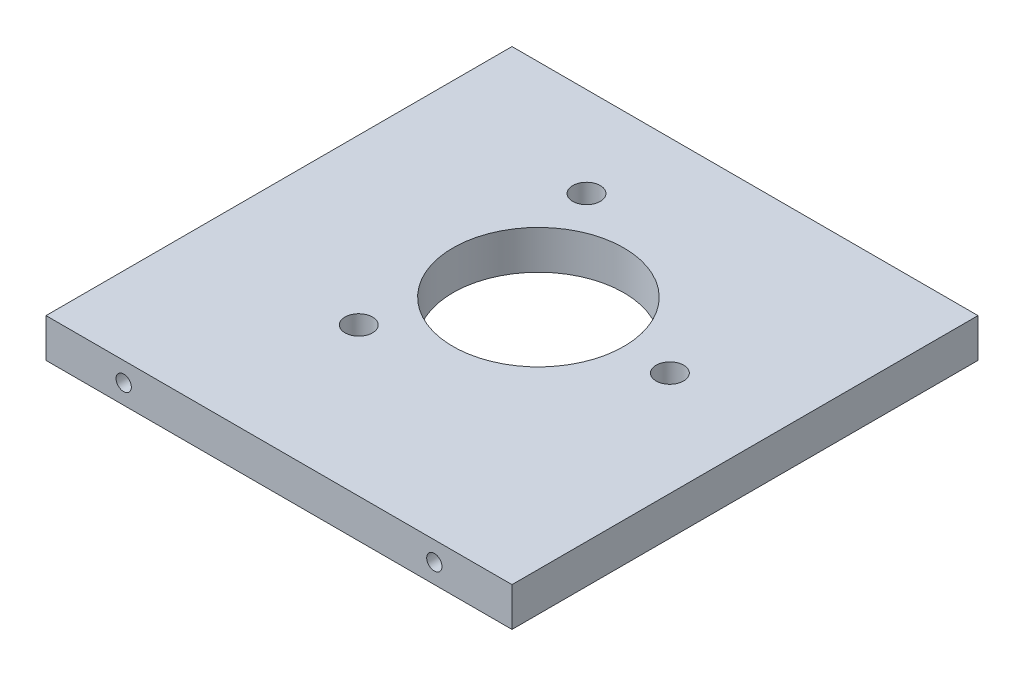
ISO-10303-21;
HEADER;
FILE_DESCRIPTION(('STEP AP214'),'2;1');
FILE_NAME('part.step','',(''),(''),'','','');
FILE_SCHEMA(('AUTOMOTIVE_DESIGN { 1 0 10303 214 1 1 1 1 }'));
ENDSEC;
DATA;
#1=APPLICATION_CONTEXT('core data for automotive mechanical design processes');
#2=APPLICATION_PROTOCOL_DEFINITION('international standard','automotive_design',2000,#1);
#3=PRODUCT_CONTEXT('',#1,'mechanical');
#4=PRODUCT('Part','Part','',(#3));
#5=PRODUCT_RELATED_PRODUCT_CATEGORY('part','',(#4));
#6=PRODUCT_DEFINITION_FORMATION('','',#4);
#7=PRODUCT_DEFINITION_CONTEXT('part definition',#1,'design');
#8=PRODUCT_DEFINITION('design','',#6,#7);
#9=PRODUCT_DEFINITION_SHAPE('','',#8);
#10=(LENGTH_UNIT() NAMED_UNIT(*) SI_UNIT(.MILLI.,.METRE.));
#11=(NAMED_UNIT(*) PLANE_ANGLE_UNIT() SI_UNIT($,.RADIAN.));
#12=(NAMED_UNIT(*) SI_UNIT($,.STERADIAN.) SOLID_ANGLE_UNIT());
#13=UNCERTAINTY_MEASURE_WITH_UNIT(LENGTH_MEASURE(1.E-05),#10,'distance_accuracy_value','');
#14=(GEOMETRIC_REPRESENTATION_CONTEXT(3) GLOBAL_UNCERTAINTY_ASSIGNED_CONTEXT((#13)) GLOBAL_UNIT_ASSIGNED_CONTEXT((#10,
#11,#12)) REPRESENTATION_CONTEXT('',''));
#15=CARTESIAN_POINT('',(0.,0.,0.));
#16=DIRECTION('',(0.,0.,1.));
#17=DIRECTION('',(1.,0.,0.));
#18=AXIS2_PLACEMENT_3D('',#15,#16,#17);
#19=CARTESIAN_POINT('',(-38.1,3.175,76.2));
#20=DIRECTION('',(1.,0.,0.));
#21=DIRECTION('',(0.,0.,-1.));
#22=AXIS2_PLACEMENT_3D('',#19,#20,#21);
#23=PLANE('',#22);
#24=DIRECTION('',(0.,0.,-1.));
#25=VECTOR('',#24,1.);
#26=CARTESIAN_POINT('',(-38.1,3.175,76.2));
#27=LINE('',#26,#25);
#28=CARTESIAN_POINT('',(-38.1,3.175,76.2));
#29=VERTEX_POINT('',#28);
#30=CARTESIAN_POINT('',(-38.1,3.175,0.));
#31=VERTEX_POINT('',#30);
#32=EDGE_CURVE('E153',#29,#31,#27,.T.);
#33=ORIENTED_EDGE('',*,*,#32,.T.);
#34=DIRECTION('',(0.,-1.,0.));
#35=VECTOR('',#34,1.);
#36=CARTESIAN_POINT('',(-38.1,3.175,0.));
#37=LINE('',#36,#35);
#38=CARTESIAN_POINT('',(-38.1,-3.175,0.));
#39=VERTEX_POINT('',#38);
#40=EDGE_CURVE('E54',#31,#39,#37,.T.);
#41=ORIENTED_EDGE('',*,*,#40,.T.);
#42=DIRECTION('',(0.,0.,-1.));
#43=VECTOR('',#42,1.);
#44=CARTESIAN_POINT('',(-38.1,-3.175,76.2));
#45=LINE('',#44,#43);
#46=CARTESIAN_POINT('',(-38.1,-3.175,76.2));
#47=VERTEX_POINT('',#46);
#48=EDGE_CURVE('E11',#47,#39,#45,.T.);
#49=ORIENTED_EDGE('',*,*,#48,.F.);
#50=DIRECTION('',(0.,-1.,0.));
#51=VECTOR('',#50,1.);
#52=CARTESIAN_POINT('',(-38.1,3.175,76.2));
#53=LINE('',#52,#51);
#54=EDGE_CURVE('E144',#29,#47,#53,.T.);
#55=ORIENTED_EDGE('',*,*,#54,.F.);
#56=EDGE_LOOP('',(#33,#41,#49,#55));
#57=FACE_BOUND('',#56,.T.);
#58=ADVANCED_FACE('F40',(#57),#23,.F.);
#59=CARTESIAN_POINT('',(38.1,-3.175,76.2));
#60=DIRECTION('',(0.,1.,0.));
#61=DIRECTION('',(0.,0.,1.));
#62=AXIS2_PLACEMENT_3D('',#59,#60,#61);
#63=PLANE('',#62);
#64=CARTESIAN_POINT('',(-11.2009516410944,-3.175,14.71452024663));
#65=DIRECTION('',(0.,-1.,0.));
#66=DIRECTION('',(0.,0.,-1.));
#67=AXIS2_PLACEMENT_3D('',#64,#65,#66);
#68=CIRCLE('',#67,4.7);
#69=CARTESIAN_POINT('',(-11.2009516410944,-3.175,10.01452024663));
#70=VERTEX_POINT('',#69);
#71=EDGE_CURVE('E112',#70,#70,#68,.T.);
#72=ORIENTED_EDGE('',*,*,#71,.F.);
#73=EDGE_LOOP('',(#72));
#74=FACE_BOUND('',#73,.T.);
#75=CARTESIAN_POINT('',(21.0490483589056,-3.175,33.334066428));
#76=DIRECTION('',(0.,-1.,0.));
#77=DIRECTION('',(0.,0.,-1.));
#78=AXIS2_PLACEMENT_3D('',#75,#76,#77);
#79=CIRCLE('',#78,4.7);
#80=CARTESIAN_POINT('',(21.0490483589056,-3.175,28.634066428));
#81=VERTEX_POINT('',#80);
#82=EDGE_CURVE('E122',#81,#81,#79,.T.);
#83=ORIENTED_EDGE('',*,*,#82,.F.);
#84=EDGE_LOOP('',(#83));
#85=FACE_BOUND('',#84,.T.);
#86=CARTESIAN_POINT('',(-11.2009516410944,-3.175,51.95361260937));
#87=DIRECTION('',(0.,-1.,0.));
#88=DIRECTION('',(0.,0.,-1.));
#89=AXIS2_PLACEMENT_3D('',#86,#87,#88);
#90=CIRCLE('',#89,4.7);
#91=CARTESIAN_POINT('',(-11.2009516410944,-3.175,47.25361260937));
#92=VERTEX_POINT('',#91);
#93=EDGE_CURVE('E131',#92,#92,#90,.T.);
#94=ORIENTED_EDGE('',*,*,#93,.F.);
#95=EDGE_LOOP('',(#94));
#96=FACE_BOUND('',#95,.T.);
#97=CARTESIAN_POINT('',(-0.450951641094426,-3.175,33.334066428));
#98=DIRECTION('',(0.,-1.,0.));
#99=DIRECTION('',(0.,0.,-1.));
#100=AXIS2_PLACEMENT_3D('',#97,#98,#99);
#101=CIRCLE('',#100,13.97);
#102=CARTESIAN_POINT('',(-0.450951641094426,-3.175,19.364066428));
#103=VERTEX_POINT('',#102);
#104=EDGE_CURVE('E140',#103,#103,#101,.T.);
#105=ORIENTED_EDGE('',*,*,#104,.F.);
#106=EDGE_LOOP('',(#105));
#107=FACE_BOUND('',#106,.T.);
#108=ORIENTED_EDGE('',*,*,#48,.T.);
#109=DIRECTION('',(-1.,0.,0.));
#110=VECTOR('',#109,1.);
#111=CARTESIAN_POINT('',(38.1,-3.175,0.));
#112=LINE('',#111,#110);
#113=CARTESIAN_POINT('',(38.1,-3.175,0.));
#114=VERTEX_POINT('',#113);
#115=EDGE_CURVE('E106',#114,#39,#112,.T.);
#116=ORIENTED_EDGE('',*,*,#115,.F.);
#117=DIRECTION('',(0.,0.,-1.));
#118=VECTOR('',#117,1.);
#119=CARTESIAN_POINT('',(38.1,-3.175,76.2));
#120=LINE('',#119,#118);
#121=CARTESIAN_POINT('',(38.1,-3.175,76.2));
#122=VERTEX_POINT('',#121);
#123=EDGE_CURVE('E47',#122,#114,#120,.T.);
#124=ORIENTED_EDGE('',*,*,#123,.F.);
#125=DIRECTION('',(1.,0.,0.));
#126=VECTOR('',#125,1.);
#127=CARTESIAN_POINT('',(38.1,-3.175,76.2));
#128=LINE('',#127,#126);
#129=EDGE_CURVE('E148',#47,#122,#128,.T.);
#130=ORIENTED_EDGE('',*,*,#129,.F.);
#131=EDGE_LOOP('',(#108,#116,#124,#130));
#132=FACE_BOUND('',#131,.T.);
#133=ADVANCED_FACE('F167',(#74,#85,#96,#107,#132),#63,.F.);
#134=CARTESIAN_POINT('',(38.1,3.175,76.2));
#135=DIRECTION('',(-1.,0.,0.));
#136=DIRECTION('',(0.,0.,1.));
#137=AXIS2_PLACEMENT_3D('',#134,#135,#136);
#138=PLANE('',#137);
#139=ORIENTED_EDGE('',*,*,#123,.T.);
#140=DIRECTION('',(0.,-1.,0.));
#141=VECTOR('',#140,1.);
#142=CARTESIAN_POINT('',(38.1,3.175,0.));
#143=LINE('',#142,#141);
#144=CARTESIAN_POINT('',(38.1,3.175,0.));
#145=VERTEX_POINT('',#144);
#146=EDGE_CURVE('E109',#145,#114,#143,.T.);
#147=ORIENTED_EDGE('',*,*,#146,.F.);
#148=DIRECTION('',(0.,0.,-1.));
#149=VECTOR('',#148,1.);
#150=CARTESIAN_POINT('',(38.1,3.175,76.2));
#151=LINE('',#150,#149);
#152=CARTESIAN_POINT('',(38.1,3.175,76.2));
#153=VERTEX_POINT('',#152);
#154=EDGE_CURVE('E156',#153,#145,#151,.T.);
#155=ORIENTED_EDGE('',*,*,#154,.F.);
#156=DIRECTION('',(0.,1.,0.));
#157=VECTOR('',#156,1.);
#158=CARTESIAN_POINT('',(38.1,3.175,76.2));
#159=LINE('',#158,#157);
#160=EDGE_CURVE('E150',#122,#153,#159,.T.);
#161=ORIENTED_EDGE('',*,*,#160,.F.);
#162=EDGE_LOOP('',(#139,#147,#155,#161));
#163=FACE_BOUND('',#162,.T.);
#164=ADVANCED_FACE('F163',(#163),#138,.F.);
#165=CARTESIAN_POINT('',(38.1,3.175,76.2));
#166=DIRECTION('',(0.,-1.,0.));
#167=DIRECTION('',(0.,0.,-1.));
#168=AXIS2_PLACEMENT_3D('',#165,#166,#167);
#169=PLANE('',#168);
#170=CARTESIAN_POINT('',(-11.2009516410944,3.175,14.71452024663));
#171=DIRECTION('',(0.,-1.,0.));
#172=DIRECTION('',(0.,0.,-1.));
#173=AXIS2_PLACEMENT_3D('',#170,#171,#172);
#174=CIRCLE('',#173,2.25);
#175=CARTESIAN_POINT('',(-11.2009516410944,3.175,12.46452024663));
#176=VERTEX_POINT('',#175);
#177=EDGE_CURVE('E119',#176,#176,#174,.T.);
#178=ORIENTED_EDGE('',*,*,#177,.T.);
#179=EDGE_LOOP('',(#178));
#180=FACE_BOUND('',#179,.T.);
#181=CARTESIAN_POINT('',(21.0490483589056,3.175,33.334066428));
#182=DIRECTION('',(0.,-1.,0.));
#183=DIRECTION('',(0.,0.,-1.));
#184=AXIS2_PLACEMENT_3D('',#181,#182,#183);
#185=CIRCLE('',#184,2.25);
#186=CARTESIAN_POINT('',(21.0490483589056,3.175,31.084066428));
#187=VERTEX_POINT('',#186);
#188=EDGE_CURVE('E128',#187,#187,#185,.T.);
#189=ORIENTED_EDGE('',*,*,#188,.T.);
#190=EDGE_LOOP('',(#189));
#191=FACE_BOUND('',#190,.T.);
#192=CARTESIAN_POINT('',(-11.2009516410944,3.175,51.95361260937));
#193=DIRECTION('',(0.,-1.,0.));
#194=DIRECTION('',(0.,0.,-1.));
#195=AXIS2_PLACEMENT_3D('',#192,#193,#194);
#196=CIRCLE('',#195,2.25);
#197=CARTESIAN_POINT('',(-11.2009516410944,3.175,49.70361260937));
#198=VERTEX_POINT('',#197);
#199=EDGE_CURVE('E137',#198,#198,#196,.T.);
#200=ORIENTED_EDGE('',*,*,#199,.T.);
#201=EDGE_LOOP('',(#200));
#202=FACE_BOUND('',#201,.T.);
#203=CARTESIAN_POINT('',(-0.450951641094426,3.175,33.334066428));
#204=DIRECTION('',(0.,-1.,0.));
#205=DIRECTION('',(0.,0.,-1.));
#206=AXIS2_PLACEMENT_3D('',#203,#204,#205);
#207=CIRCLE('',#206,13.97);
#208=CARTESIAN_POINT('',(-0.450951641094426,3.175,19.364066428));
#209=VERTEX_POINT('',#208);
#210=EDGE_CURVE('E141',#209,#209,#207,.T.);
#211=ORIENTED_EDGE('',*,*,#210,.T.);
#212=EDGE_LOOP('',(#211));
#213=FACE_BOUND('',#212,.T.);
#214=ORIENTED_EDGE('',*,*,#154,.T.);
#215=DIRECTION('',(-1.,0.,0.));
#216=VECTOR('',#215,1.);
#217=CARTESIAN_POINT('',(38.1,3.175,0.));
#218=LINE('',#217,#216);
#219=EDGE_CURVE('E107',#145,#31,#218,.T.);
#220=ORIENTED_EDGE('',*,*,#219,.T.);
#221=ORIENTED_EDGE('',*,*,#32,.F.);
#222=DIRECTION('',(-1.,0.,0.));
#223=VECTOR('',#222,1.);
#224=CARTESIAN_POINT('',(38.1,3.175,76.2));
#225=LINE('',#224,#223);
#226=EDGE_CURVE('E62',#153,#29,#225,.T.);
#227=ORIENTED_EDGE('',*,*,#226,.F.);
#228=EDGE_LOOP('',(#214,#220,#221,#227));
#229=FACE_BOUND('',#228,.T.);
#230=ADVANCED_FACE('F173',(#180,#191,#202,#213,#229),#169,.F.);
#231=CARTESIAN_POINT('',(0.,0.,76.2));
#232=DIRECTION('',(0.,0.,-1.));
#233=DIRECTION('',(-1.,0.,0.));
#234=AXIS2_PLACEMENT_3D('',#231,#232,#233);
#235=PLANE('',#234);
#236=CARTESIAN_POINT('',(25.4,0.,76.2));
#237=DIRECTION('',(0.,0.,1.));
#238=DIRECTION('',(1.,0.,0.));
#239=AXIS2_PLACEMENT_3D('',#236,#237,#238);
#240=CIRCLE('',#239,1.24999999999999);
#241=CARTESIAN_POINT('',(26.65,0.,76.2));
#242=VERTEX_POINT('',#241);
#243=EDGE_CURVE('E96',#242,#242,#240,.T.);
#244=ORIENTED_EDGE('',*,*,#243,.F.);
#245=EDGE_LOOP('',(#244));
#246=FACE_BOUND('',#245,.T.);
#247=CARTESIAN_POINT('',(-25.4,0.,76.2));
#248=DIRECTION('',(0.,0.,1.));
#249=DIRECTION('',(1.,0.,0.));
#250=AXIS2_PLACEMENT_3D('',#247,#248,#249);
#251=CIRCLE('',#250,1.24999999999999);
#252=CARTESIAN_POINT('',(-24.15,0.,76.2));
#253=VERTEX_POINT('',#252);
#254=EDGE_CURVE('E95',#253,#253,#251,.T.);
#255=ORIENTED_EDGE('',*,*,#254,.F.);
#256=EDGE_LOOP('',(#255));
#257=FACE_BOUND('',#256,.T.);
#258=ORIENTED_EDGE('',*,*,#54,.T.);
#259=ORIENTED_EDGE('',*,*,#129,.T.);
#260=ORIENTED_EDGE('',*,*,#160,.T.);
#261=ORIENTED_EDGE('',*,*,#226,.T.);
#262=EDGE_LOOP('',(#258,#259,#260,#261));
#263=FACE_BOUND('',#262,.T.);
#264=ADVANCED_FACE('F175',(#246,#257,#263),#235,.F.);
#265=CARTESIAN_POINT('',(-0.450951641094426,3.175,33.334066428));
#266=DIRECTION('',(0.,-1.,0.));
#267=DIRECTION('',(0.,0.,-1.));
#268=AXIS2_PLACEMENT_3D('',#265,#266,#267);
#269=CYLINDRICAL_SURFACE('',#268,13.97);
#270=ORIENTED_EDGE('',*,*,#210,.F.);
#271=EDGE_LOOP('',(#270));
#272=FACE_BOUND('',#271,.T.);
#273=ORIENTED_EDGE('',*,*,#104,.T.);
#274=EDGE_LOOP('',(#273));
#275=FACE_BOUND('',#274,.T.);
#276=ADVANCED_FACE('F182',(#272,#275),#269,.F.);
#277=CARTESIAN_POINT('',(-11.2009516410944,-3.175,51.95361260937));
#278=DIRECTION('',(0.,-1.,0.));
#279=DIRECTION('',(0.,0.,-1.));
#280=AXIS2_PLACEMENT_3D('',#277,#278,#279);
#281=CYLINDRICAL_SURFACE('',#280,2.25);
#282=ORIENTED_EDGE('',*,*,#199,.F.);
#283=EDGE_LOOP('',(#282));
#284=FACE_BOUND('',#283,.T.);
#285=CARTESIAN_POINT('',(-11.2009516410944,-0.725000000000001,51.95361260937));
#286=DIRECTION('',(0.,-1.,0.));
#287=DIRECTION('',(0.,0.,-1.));
#288=AXIS2_PLACEMENT_3D('',#285,#286,#287);
#289=CIRCLE('',#288,2.25);
#290=CARTESIAN_POINT('',(-11.2009516410944,-0.725000000000001,49.70361260937));
#291=VERTEX_POINT('',#290);
#292=EDGE_CURVE('E134',#291,#291,#289,.T.);
#293=ORIENTED_EDGE('',*,*,#292,.T.);
#294=EDGE_LOOP('',(#293));
#295=FACE_BOUND('',#294,.T.);
#296=ADVANCED_FACE('F203',(#284,#295),#281,.F.);
#297=CARTESIAN_POINT('',(-11.2009516410944,-3.175,51.95361260937));
#298=DIRECTION('',(0.,-1.,0.));
#299=DIRECTION('',(0.,0.,-1.));
#300=AXIS2_PLACEMENT_3D('',#297,#298,#299);
#301=CONICAL_SURFACE('',#300,4.7,0.785398163397449);
#302=ORIENTED_EDGE('',*,*,#292,.F.);
#303=EDGE_LOOP('',(#302));
#304=FACE_BOUND('',#303,.T.);
#305=ORIENTED_EDGE('',*,*,#93,.T.);
#306=EDGE_LOOP('',(#305));
#307=FACE_BOUND('',#306,.T.);
#308=ADVANCED_FACE('F209',(#304,#307),#301,.F.);
#309=CARTESIAN_POINT('',(21.0490483589056,-3.175,33.334066428));
#310=DIRECTION('',(0.,-1.,0.));
#311=DIRECTION('',(0.,0.,-1.));
#312=AXIS2_PLACEMENT_3D('',#309,#310,#311);
#313=CYLINDRICAL_SURFACE('',#312,2.25);
#314=ORIENTED_EDGE('',*,*,#188,.F.);
#315=EDGE_LOOP('',(#314));
#316=FACE_BOUND('',#315,.T.);
#317=CARTESIAN_POINT('',(21.0490483589056,-0.725000000000001,33.334066428));
#318=DIRECTION('',(0.,-1.,0.));
#319=DIRECTION('',(0.,0.,-1.));
#320=AXIS2_PLACEMENT_3D('',#317,#318,#319);
#321=CIRCLE('',#320,2.25);
#322=CARTESIAN_POINT('',(21.0490483589056,-0.725000000000001,31.084066428));
#323=VERTEX_POINT('',#322);
#324=EDGE_CURVE('E125',#323,#323,#321,.T.);
#325=ORIENTED_EDGE('',*,*,#324,.T.);
#326=EDGE_LOOP('',(#325));
#327=FACE_BOUND('',#326,.T.);
#328=ADVANCED_FACE('F216',(#316,#327),#313,.F.);
#329=CARTESIAN_POINT('',(21.0490483589056,-3.175,33.334066428));
#330=DIRECTION('',(0.,-1.,0.));
#331=DIRECTION('',(0.,0.,-1.));
#332=AXIS2_PLACEMENT_3D('',#329,#330,#331);
#333=CONICAL_SURFACE('',#332,4.7,0.785398163397449);
#334=ORIENTED_EDGE('',*,*,#324,.F.);
#335=EDGE_LOOP('',(#334));
#336=FACE_BOUND('',#335,.T.);
#337=ORIENTED_EDGE('',*,*,#82,.T.);
#338=EDGE_LOOP('',(#337));
#339=FACE_BOUND('',#338,.T.);
#340=ADVANCED_FACE('F220',(#336,#339),#333,.F.);
#341=CARTESIAN_POINT('',(-11.2009516410944,-3.175,14.71452024663));
#342=DIRECTION('',(0.,-1.,0.));
#343=DIRECTION('',(0.,0.,-1.));
#344=AXIS2_PLACEMENT_3D('',#341,#342,#343);
#345=CYLINDRICAL_SURFACE('',#344,2.25);
#346=ORIENTED_EDGE('',*,*,#177,.F.);
#347=EDGE_LOOP('',(#346));
#348=FACE_BOUND('',#347,.T.);
#349=CARTESIAN_POINT('',(-11.2009516410944,-0.725000000000001,14.71452024663));
#350=DIRECTION('',(0.,-1.,0.));
#351=DIRECTION('',(0.,0.,-1.));
#352=AXIS2_PLACEMENT_3D('',#349,#350,#351);
#353=CIRCLE('',#352,2.25);
#354=CARTESIAN_POINT('',(-11.2009516410944,-0.725000000000001,12.46452024663));
#355=VERTEX_POINT('',#354);
#356=EDGE_CURVE('E116',#355,#355,#353,.T.);
#357=ORIENTED_EDGE('',*,*,#356,.T.);
#358=EDGE_LOOP('',(#357));
#359=FACE_BOUND('',#358,.T.);
#360=ADVANCED_FACE('F224',(#348,#359),#345,.F.);
#361=CARTESIAN_POINT('',(-11.2009516410944,-3.175,14.71452024663));
#362=DIRECTION('',(0.,-1.,0.));
#363=DIRECTION('',(0.,0.,-1.));
#364=AXIS2_PLACEMENT_3D('',#361,#362,#363);
#365=CONICAL_SURFACE('',#364,4.7,0.785398163397449);
#366=ORIENTED_EDGE('',*,*,#356,.F.);
#367=EDGE_LOOP('',(#366));
#368=FACE_BOUND('',#367,.T.);
#369=ORIENTED_EDGE('',*,*,#71,.T.);
#370=EDGE_LOOP('',(#369));
#371=FACE_BOUND('',#370,.T.);
#372=ADVANCED_FACE('F228',(#368,#371),#365,.F.);
#373=CARTESIAN_POINT('',(38.1,3.175,0.));
#374=DIRECTION('',(0.,0.,1.));
#375=DIRECTION('',(1.,0.,0.));
#376=AXIS2_PLACEMENT_3D('',#373,#374,#375);
#377=PLANE('',#376);
#378=ORIENTED_EDGE('',*,*,#115,.T.);
#379=ORIENTED_EDGE('',*,*,#40,.F.);
#380=ORIENTED_EDGE('',*,*,#219,.F.);
#381=ORIENTED_EDGE('',*,*,#146,.T.);
#382=EDGE_LOOP('',(#378,#379,#380,#381));
#383=FACE_BOUND('',#382,.T.);
#384=ADVANCED_FACE('F169',(#383),#377,.F.);
#385=CARTESIAN_POINT('',(-25.4,0.,64.2510757737845));
#386=DIRECTION('',(0.,0.,1.));
#387=DIRECTION('',(1.,0.,0.));
#388=AXIS2_PLACEMENT_3D('',#385,#386,#387);
#389=CONICAL_SURFACE('',#388,1.25,1.02974425867665);
#390=CARTESIAN_POINT('',(-25.4,0.,63.5));
#391=VERTEX_POINT('',#390);
#392=VERTEX_LOOP('',#391);
#393=FACE_BOUND('',#392,.T.);
#394=CARTESIAN_POINT('',(-25.4,0.,64.2510757737845));
#395=DIRECTION('',(0.,0.,1.));
#396=DIRECTION('',(1.,0.,0.));
#397=AXIS2_PLACEMENT_3D('',#394,#395,#396);
#398=CIRCLE('',#397,1.25);
#399=CARTESIAN_POINT('',(-24.15,0.,64.2510757737845));
#400=VERTEX_POINT('',#399);
#401=EDGE_CURVE('E99',#400,#400,#398,.T.);
#402=ORIENTED_EDGE('',*,*,#401,.T.);
#403=EDGE_LOOP('',(#402));
#404=FACE_BOUND('',#403,.T.);
#405=ADVANCED_FACE('F235',(#393,#404),#389,.F.);
#406=CARTESIAN_POINT('',(-25.4,0.,76.2));
#407=DIRECTION('',(0.,0.,1.));
#408=DIRECTION('',(1.,0.,0.));
#409=AXIS2_PLACEMENT_3D('',#406,#407,#408);
#410=CYLINDRICAL_SURFACE('',#409,1.24999999999999);
#411=ORIENTED_EDGE('',*,*,#401,.F.);
#412=EDGE_LOOP('',(#411));
#413=FACE_BOUND('',#412,.T.);
#414=ORIENTED_EDGE('',*,*,#254,.T.);
#415=EDGE_LOOP('',(#414));
#416=FACE_BOUND('',#415,.T.);
#417=ADVANCED_FACE('F89',(#413,#416),#410,.F.);
#418=CARTESIAN_POINT('',(25.4,0.,64.2510757737845));
#419=DIRECTION('',(0.,0.,1.));
#420=DIRECTION('',(1.,0.,0.));
#421=AXIS2_PLACEMENT_3D('',#418,#419,#420);
#422=CONICAL_SURFACE('',#421,1.25,1.02974425867665);
#423=CARTESIAN_POINT('',(25.4,0.,63.5));
#424=VERTEX_POINT('',#423);
#425=VERTEX_LOOP('',#424);
#426=FACE_BOUND('',#425,.T.);
#427=CARTESIAN_POINT('',(25.4,0.,64.2510757737845));
#428=DIRECTION('',(0.,0.,1.));
#429=DIRECTION('',(1.,0.,0.));
#430=AXIS2_PLACEMENT_3D('',#427,#428,#429);
#431=CIRCLE('',#430,1.25);
#432=CARTESIAN_POINT('',(26.65,0.,64.2510757737845));
#433=VERTEX_POINT('',#432);
#434=EDGE_CURVE('E93',#433,#433,#431,.T.);
#435=ORIENTED_EDGE('',*,*,#434,.T.);
#436=EDGE_LOOP('',(#435));
#437=FACE_BOUND('',#436,.T.);
#438=ADVANCED_FACE('F85',(#426,#437),#422,.F.);
#439=CARTESIAN_POINT('',(25.4,0.,76.2));
#440=DIRECTION('',(0.,0.,1.));
#441=DIRECTION('',(1.,0.,0.));
#442=AXIS2_PLACEMENT_3D('',#439,#440,#441);
#443=CYLINDRICAL_SURFACE('',#442,1.24999999999999);
#444=ORIENTED_EDGE('',*,*,#434,.F.);
#445=EDGE_LOOP('',(#444));
#446=FACE_BOUND('',#445,.T.);
#447=ORIENTED_EDGE('',*,*,#243,.T.);
#448=EDGE_LOOP('',(#447));
#449=FACE_BOUND('',#448,.T.);
#450=ADVANCED_FACE('F88',(#446,#449),#443,.F.);
#451=CLOSED_SHELL('',(#58,#133,#164,#230,#264,#276,#296,#308,#328,#340,#360,#372,#384,#405,#417,
#438,#450));
#452=MANIFOLD_SOLID_BREP('B2',#451);
#453=ADVANCED_BREP_SHAPE_REPRESENTATION('',(#18,#452),#14);
#454=SHAPE_DEFINITION_REPRESENTATION(#9,#453);
ENDSEC;
END-ISO-10303-21;
